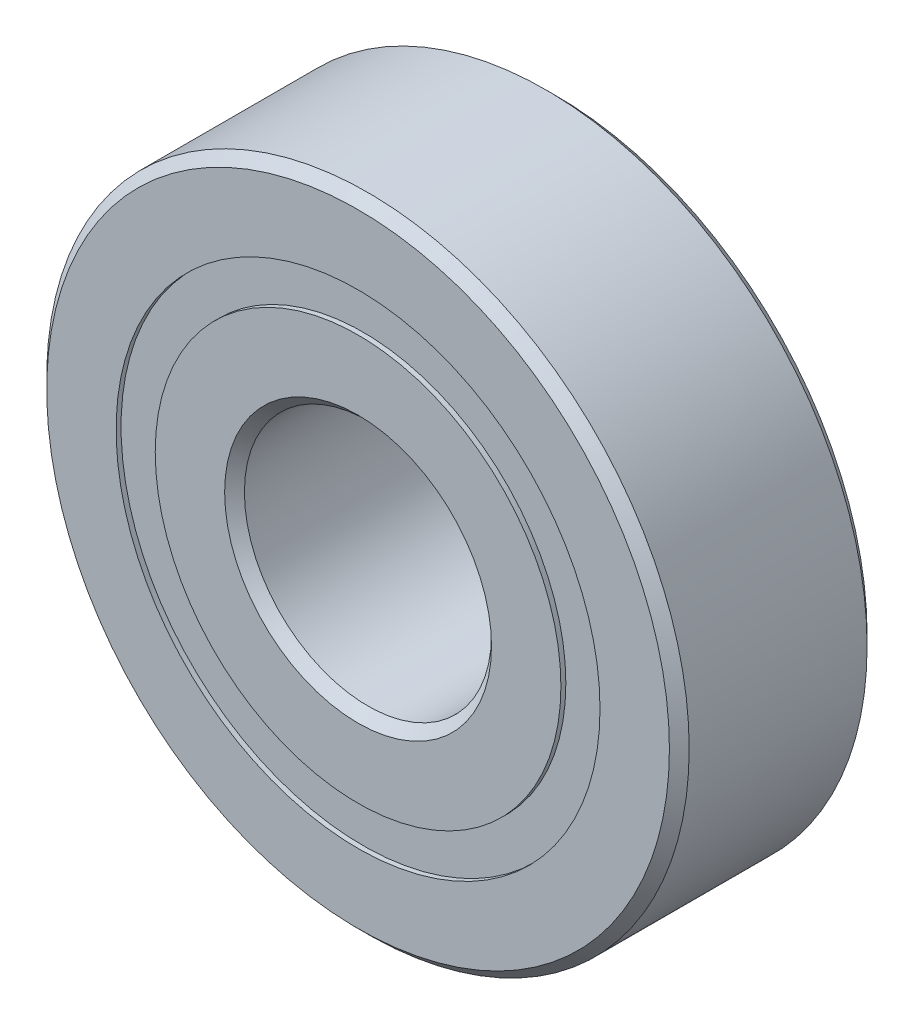
ISO-10303-21;
HEADER;
FILE_DESCRIPTION(('STEP AP214'),'2;1');
FILE_NAME('part.step','',(''),(''),'','','');
FILE_SCHEMA(('AUTOMOTIVE_DESIGN { 1 0 10303 214 1 1 1 1 }'));
ENDSEC;
DATA;
#1=APPLICATION_CONTEXT('core data for automotive mechanical design processes');
#2=APPLICATION_PROTOCOL_DEFINITION('international standard','automotive_design',2000,#1);
#3=PRODUCT_CONTEXT('',#1,'mechanical');
#4=PRODUCT('Part','Part','',(#3));
#5=PRODUCT_RELATED_PRODUCT_CATEGORY('part','',(#4));
#6=PRODUCT_DEFINITION_FORMATION('','',#4);
#7=PRODUCT_DEFINITION_CONTEXT('part definition',#1,'design');
#8=PRODUCT_DEFINITION('design','',#6,#7);
#9=PRODUCT_DEFINITION_SHAPE('','',#8);
#10=(LENGTH_UNIT() NAMED_UNIT(*) SI_UNIT(.MILLI.,.METRE.));
#11=(NAMED_UNIT(*) PLANE_ANGLE_UNIT() SI_UNIT($,.RADIAN.));
#12=(NAMED_UNIT(*) SI_UNIT($,.STERADIAN.) SOLID_ANGLE_UNIT());
#13=UNCERTAINTY_MEASURE_WITH_UNIT(LENGTH_MEASURE(1.E-05),#10,'distance_accuracy_value','');
#14=(GEOMETRIC_REPRESENTATION_CONTEXT(3) GLOBAL_UNCERTAINTY_ASSIGNED_CONTEXT((#13)) GLOBAL_UNIT_ASSIGNED_CONTEXT((#10,
#11,#12)) REPRESENTATION_CONTEXT('',''));
#15=CARTESIAN_POINT('',(0.,0.,0.));
#16=DIRECTION('',(0.,0.,1.));
#17=DIRECTION('',(1.,0.,0.));
#18=AXIS2_PLACEMENT_3D('',#15,#16,#17);
#19=CARTESIAN_POINT('',(0.,4.8956043956044,-1.9));
#20=DIRECTION('',(0.,0.,1.));
#21=DIRECTION('',(1.,0.,0.));
#22=AXIS2_PLACEMENT_3D('',#19,#20,#21);
#23=PLANE('',#22);
#24=CARTESIAN_POINT('',(0.,0.,-1.9));
#25=DIRECTION('',(0.,0.,1.));
#26=DIRECTION('',(1.,0.,0.));
#27=AXIS2_PLACEMENT_3D('',#24,#25,#26);
#28=CIRCLE('',#27,4.8956043956044);
#29=CARTESIAN_POINT('',(4.8956043956044,0.,-1.9));
#30=VERTEX_POINT('',#29);
#31=EDGE_CURVE('E57',#30,#30,#28,.T.);
#32=ORIENTED_EDGE('',*,*,#31,.F.);
#33=EDGE_LOOP('',(#32));
#34=FACE_BOUND('',#33,.T.);
#35=CARTESIAN_POINT('',(0.,0.,-1.9));
#36=DIRECTION('',(0.,0.,1.));
#37=DIRECTION('',(1.,0.,0.));
#38=AXIS2_PLACEMENT_3D('',#35,#36,#37);
#39=CIRCLE('',#38,4.1043956043956);
#40=CARTESIAN_POINT('',(4.1043956043956,0.,-1.9));
#41=VERTEX_POINT('',#40);
#42=EDGE_CURVE('E11',#41,#41,#39,.T.);
#43=ORIENTED_EDGE('',*,*,#42,.T.);
#44=EDGE_LOOP('',(#43));
#45=FACE_BOUND('',#44,.T.);
#46=ADVANCED_FACE('F43',(#34,#45),#23,.F.);
#47=CARTESIAN_POINT('',(0.,0.,2.));
#48=DIRECTION('',(0.,0.,1.));
#49=DIRECTION('',(1.,0.,0.));
#50=AXIS2_PLACEMENT_3D('',#47,#48,#49);
#51=CYLINDRICAL_SURFACE('',#50,4.1043956043956);
#52=ORIENTED_EDGE('',*,*,#42,.F.);
#53=EDGE_LOOP('',(#52));
#54=FACE_BOUND('',#53,.T.);
#55=CARTESIAN_POINT('',(0.,0.,-0.972947220876674));
#56=DIRECTION('',(0.,0.,1.));
#57=DIRECTION('',(1.,0.,0.));
#58=AXIS2_PLACEMENT_3D('',#55,#56,#57);
#59=CIRCLE('',#58,4.1043956043956);
#60=CARTESIAN_POINT('',(4.1043956043956,0.,-0.972947220876674));
#61=VERTEX_POINT('',#60);
#62=EDGE_CURVE('E49',#61,#61,#59,.T.);
#63=ORIENTED_EDGE('',*,*,#62,.T.);
#64=EDGE_LOOP('',(#63));
#65=FACE_BOUND('',#64,.T.);
#66=ADVANCED_FACE('F66',(#54,#65),#51,.F.);
#67=CARTESIAN_POINT('',(0.,4.8956043956044,-0.972947220876674));
#68=DIRECTION('',(0.,0.,-1.));
#69=DIRECTION('',(-1.,0.,0.));
#70=AXIS2_PLACEMENT_3D('',#67,#68,#69);
#71=PLANE('',#70);
#72=ORIENTED_EDGE('',*,*,#62,.F.);
#73=EDGE_LOOP('',(#72));
#74=FACE_BOUND('',#73,.T.);
#75=CARTESIAN_POINT('',(0.,0.,-0.972947220876674));
#76=DIRECTION('',(0.,0.,1.));
#77=DIRECTION('',(1.,0.,0.));
#78=AXIS2_PLACEMENT_3D('',#75,#76,#77);
#79=CIRCLE('',#78,4.8956043956044);
#80=CARTESIAN_POINT('',(4.8956043956044,0.,-0.972947220876674));
#81=VERTEX_POINT('',#80);
#82=EDGE_CURVE('E53',#81,#81,#79,.T.);
#83=ORIENTED_EDGE('',*,*,#82,.T.);
#84=EDGE_LOOP('',(#83));
#85=FACE_BOUND('',#84,.T.);
#86=ADVANCED_FACE('F70',(#74,#85),#71,.F.);
#87=CARTESIAN_POINT('',(0.,0.,2.));
#88=DIRECTION('',(0.,0.,1.));
#89=DIRECTION('',(1.,0.,0.));
#90=AXIS2_PLACEMENT_3D('',#87,#88,#89);
#91=CYLINDRICAL_SURFACE('',#90,4.8956043956044);
#92=ORIENTED_EDGE('',*,*,#82,.F.);
#93=EDGE_LOOP('',(#92));
#94=FACE_BOUND('',#93,.T.);
#95=ORIENTED_EDGE('',*,*,#31,.T.);
#96=EDGE_LOOP('',(#95));
#97=FACE_BOUND('',#96,.T.);
#98=ADVANCED_FACE('F63',(#94,#97),#91,.T.);
#99=CLOSED_SHELL('',(#46,#66,#86,#98));
#100=MANIFOLD_SOLID_BREP('B2',#99);
#101=CARTESIAN_POINT('',(0.,4.8956043956044,1.9));
#102=DIRECTION('',(0.,0.,-1.));
#103=DIRECTION('',(-1.,0.,0.));
#104=AXIS2_PLACEMENT_3D('',#101,#102,#103);
#105=PLANE('',#104);
#106=CARTESIAN_POINT('',(0.,0.,1.9));
#107=DIRECTION('',(0.,0.,1.));
#108=DIRECTION('',(1.,0.,0.));
#109=AXIS2_PLACEMENT_3D('',#106,#107,#108);
#110=CIRCLE('',#109,4.1043956043956);
#111=CARTESIAN_POINT('',(4.1043956043956,0.,1.9));
#112=VERTEX_POINT('',#111);
#113=EDGE_CURVE('E42',#112,#112,#110,.T.);
#114=ORIENTED_EDGE('',*,*,#113,.F.);
#115=EDGE_LOOP('',(#114));
#116=FACE_BOUND('',#115,.T.);
#117=CARTESIAN_POINT('',(0.,0.,1.9));
#118=DIRECTION('',(0.,0.,1.));
#119=DIRECTION('',(1.,0.,0.));
#120=AXIS2_PLACEMENT_3D('',#117,#118,#119);
#121=CIRCLE('',#120,4.8956043956044);
#122=CARTESIAN_POINT('',(4.8956043956044,0.,1.9));
#123=VERTEX_POINT('',#122);
#124=EDGE_CURVE('E124',#123,#123,#121,.T.);
#125=ORIENTED_EDGE('',*,*,#124,.T.);
#126=EDGE_LOOP('',(#125));
#127=FACE_BOUND('',#126,.T.);
#128=ADVANCED_FACE('F110',(#116,#127),#105,.F.);
#129=CARTESIAN_POINT('',(0.,0.,2.));
#130=DIRECTION('',(0.,0.,1.));
#131=DIRECTION('',(1.,0.,0.));
#132=AXIS2_PLACEMENT_3D('',#129,#130,#131);
#133=CYLINDRICAL_SURFACE('',#132,4.1043956043956);
#134=CARTESIAN_POINT('',(0.,0.,0.972947220876673));
#135=DIRECTION('',(0.,0.,1.));
#136=DIRECTION('',(1.,0.,0.));
#137=AXIS2_PLACEMENT_3D('',#134,#135,#136);
#138=CIRCLE('',#137,4.1043956043956);
#139=CARTESIAN_POINT('',(4.1043956043956,0.,0.972947220876673));
#140=VERTEX_POINT('',#139);
#141=EDGE_CURVE('E116',#140,#140,#138,.T.);
#142=ORIENTED_EDGE('',*,*,#141,.F.);
#143=EDGE_LOOP('',(#142));
#144=FACE_BOUND('',#143,.T.);
#145=ORIENTED_EDGE('',*,*,#113,.T.);
#146=EDGE_LOOP('',(#145));
#147=FACE_BOUND('',#146,.T.);
#148=ADVANCED_FACE('F139',(#144,#147),#133,.F.);
#149=CARTESIAN_POINT('',(0.,4.8956043956044,0.972947220876673));
#150=DIRECTION('',(0.,0.,1.));
#151=DIRECTION('',(1.,0.,0.));
#152=AXIS2_PLACEMENT_3D('',#149,#150,#151);
#153=PLANE('',#152);
#154=CARTESIAN_POINT('',(0.,0.,0.972947220876673));
#155=DIRECTION('',(0.,0.,1.));
#156=DIRECTION('',(1.,0.,0.));
#157=AXIS2_PLACEMENT_3D('',#154,#155,#156);
#158=CIRCLE('',#157,4.8956043956044);
#159=CARTESIAN_POINT('',(4.8956043956044,0.,0.972947220876673));
#160=VERTEX_POINT('',#159);
#161=EDGE_CURVE('E120',#160,#160,#158,.T.);
#162=ORIENTED_EDGE('',*,*,#161,.F.);
#163=EDGE_LOOP('',(#162));
#164=FACE_BOUND('',#163,.T.);
#165=ORIENTED_EDGE('',*,*,#141,.T.);
#166=EDGE_LOOP('',(#165));
#167=FACE_BOUND('',#166,.T.);
#168=ADVANCED_FACE('F134',(#164,#167),#153,.F.);
#169=CARTESIAN_POINT('',(0.,0.,2.));
#170=DIRECTION('',(0.,0.,1.));
#171=DIRECTION('',(1.,0.,0.));
#172=AXIS2_PLACEMENT_3D('',#169,#170,#171);
#173=CYLINDRICAL_SURFACE('',#172,4.8956043956044);
#174=ORIENTED_EDGE('',*,*,#124,.F.);
#175=EDGE_LOOP('',(#174));
#176=FACE_BOUND('',#175,.T.);
#177=ORIENTED_EDGE('',*,*,#161,.T.);
#178=EDGE_LOOP('',(#177));
#179=FACE_BOUND('',#178,.T.);
#180=ADVANCED_FACE('F131',(#176,#179),#173,.T.);
#181=CLOSED_SHELL('',(#128,#148,#168,#180));
#182=MANIFOLD_SOLID_BREP('B6',#181);
#183=CARTESIAN_POINT('',(-2.24999999999995,3.89711431703,0.));
#184=DIRECTION('',(0.,0.,1.));
#185=DIRECTION('',(-0.499999999999989,0.866025403784445,0.));
#186=AXIS2_PLACEMENT_3D('',#183,#184,#185);
#187=SPHERICAL_SURFACE('',#186,0.972947220876674);
#188=CARTESIAN_POINT('',(-2.24999999999995,3.89711431703,0.972947220876673));
#189=VERTEX_POINT('',#188);
#190=VERTEX_LOOP('',#189);
#191=FACE_BOUND('',#190,.T.);
#192=ADVANCED_FACE('F177',(#191),#187,.T.);
#193=CLOSED_SHELL('',(#192));
#194=MANIFOLD_SOLID_BREP('B37',#193);
#195=CARTESIAN_POINT('',(-3.89711431702995,2.25000000000005,0.));
#196=DIRECTION('',(0.,0.,1.));
#197=DIRECTION('',(-0.866025403784433,0.50000000000001,0.));
#198=AXIS2_PLACEMENT_3D('',#195,#196,#197);
#199=SPHERICAL_SURFACE('',#198,0.972947220876674);
#200=CARTESIAN_POINT('',(-3.89711431702995,2.25000000000005,0.972947220876673));
#201=VERTEX_POINT('',#200);
#202=VERTEX_LOOP('',#201);
#203=FACE_BOUND('',#202,.T.);
#204=ADVANCED_FACE('F197',(#203),#199,.T.);
#205=CLOSED_SHELL('',(#204));
#206=MANIFOLD_SOLID_BREP('B106',#205);
#207=CARTESIAN_POINT('',(-4.5,0.,0.));
#208=DIRECTION('',(0.,0.,1.));
#209=DIRECTION('',(-1.,0.,0.));
#210=AXIS2_PLACEMENT_3D('',#207,#208,#209);
#211=SPHERICAL_SURFACE('',#210,0.972947220876674);
#212=CARTESIAN_POINT('',(-4.5,0.,0.972947220876673));
#213=VERTEX_POINT('',#212);
#214=VERTEX_LOOP('',#213);
#215=FACE_BOUND('',#214,.T.);
#216=ADVANCED_FACE('F217',(#215),#211,.T.);
#217=CLOSED_SHELL('',(#216));
#218=MANIFOLD_SOLID_BREP('B173',#217);
#219=CARTESIAN_POINT('',(-3.89711431702999,-2.24999999999996,0.));
#220=DIRECTION('',(0.,0.,1.));
#221=DIRECTION('',(-0.866025403784443,-0.499999999999992,0.));
#222=AXIS2_PLACEMENT_3D('',#219,#220,#221);
#223=SPHERICAL_SURFACE('',#222,0.972947220876674);
#224=CARTESIAN_POINT('',(-3.89711431702999,-2.24999999999996,0.972947220876673));
#225=VERTEX_POINT('',#224);
#226=VERTEX_LOOP('',#225);
#227=FACE_BOUND('',#226,.T.);
#228=ADVANCED_FACE('F237',(#227),#223,.T.);
#229=CLOSED_SHELL('',(#228));
#230=MANIFOLD_SOLID_BREP('B193',#229);
#231=CARTESIAN_POINT('',(-2.25000000000003,-3.89711431702996,0.));
#232=DIRECTION('',(0.,0.,1.));
#233=DIRECTION('',(-0.500000000000007,-0.866025403784435,0.));
#234=AXIS2_PLACEMENT_3D('',#231,#232,#233);
#235=SPHERICAL_SURFACE('',#234,0.972947220876674);
#236=CARTESIAN_POINT('',(-2.25000000000003,-3.89711431702996,0.972947220876673));
#237=VERTEX_POINT('',#236);
#238=VERTEX_LOOP('',#237);
#239=FACE_BOUND('',#238,.T.);
#240=ADVANCED_FACE('F257',(#239),#235,.T.);
#241=CLOSED_SHELL('',(#240));
#242=MANIFOLD_SOLID_BREP('B213',#241);
#243=CARTESIAN_POINT('',(0.,-4.5,0.));
#244=DIRECTION('',(0.,0.,1.));
#245=DIRECTION('',(0.,-1.,0.));
#246=AXIS2_PLACEMENT_3D('',#243,#244,#245);
#247=SPHERICAL_SURFACE('',#246,0.972947220876674);
#248=CARTESIAN_POINT('',(0.,-4.5,0.972947220876673));
#249=VERTEX_POINT('',#248);
#250=VERTEX_LOOP('',#249);
#251=FACE_BOUND('',#250,.T.);
#252=ADVANCED_FACE('F277',(#251),#247,.T.);
#253=CLOSED_SHELL('',(#252));
#254=MANIFOLD_SOLID_BREP('B233',#253);
#255=CARTESIAN_POINT('',(2.24999999999998,-3.89711431702999,0.));
#256=DIRECTION('',(0.,0.,1.));
#257=DIRECTION('',(0.499999999999995,-0.866025403784442,0.));
#258=AXIS2_PLACEMENT_3D('',#255,#256,#257);
#259=SPHERICAL_SURFACE('',#258,0.972947220876674);
#260=CARTESIAN_POINT('',(2.24999999999998,-3.89711431702999,0.972947220876673));
#261=VERTEX_POINT('',#260);
#262=VERTEX_LOOP('',#261);
#263=FACE_BOUND('',#262,.T.);
#264=ADVANCED_FACE('F297',(#263),#259,.T.);
#265=CLOSED_SHELL('',(#264));
#266=MANIFOLD_SOLID_BREP('B253',#265);
#267=CARTESIAN_POINT('',(3.89711431702996,-2.25000000000002,0.));
#268=DIRECTION('',(0.,0.,1.));
#269=DIRECTION('',(0.866025403784436,-0.500000000000004,0.));
#270=AXIS2_PLACEMENT_3D('',#267,#268,#269);
#271=SPHERICAL_SURFACE('',#270,0.972947220876674);
#272=CARTESIAN_POINT('',(3.89711431702996,-2.25000000000002,0.972947220876673));
#273=VERTEX_POINT('',#272);
#274=VERTEX_LOOP('',#273);
#275=FACE_BOUND('',#274,.T.);
#276=ADVANCED_FACE('F317',(#275),#271,.T.);
#277=CLOSED_SHELL('',(#276));
#278=MANIFOLD_SOLID_BREP('B273',#277);
#279=CARTESIAN_POINT('',(4.5,0.,0.));
#280=DIRECTION('',(0.,0.,1.));
#281=DIRECTION('',(1.,0.,0.));
#282=AXIS2_PLACEMENT_3D('',#279,#280,#281);
#283=SPHERICAL_SURFACE('',#282,0.972947220876674);
#284=CARTESIAN_POINT('',(4.5,0.,0.972947220876673));
#285=VERTEX_POINT('',#284);
#286=VERTEX_LOOP('',#285);
#287=FACE_BOUND('',#286,.T.);
#288=ADVANCED_FACE('F337',(#287),#283,.T.);
#289=CLOSED_SHELL('',(#288));
#290=MANIFOLD_SOLID_BREP('B293',#289);
#291=CARTESIAN_POINT('',(3.89711431702998,2.24999999999999,0.));
#292=DIRECTION('',(0.,0.,1.));
#293=DIRECTION('',(0.86602540378444,0.499999999999998,0.));
#294=AXIS2_PLACEMENT_3D('',#291,#292,#293);
#295=SPHERICAL_SURFACE('',#294,0.972947220876674);
#296=CARTESIAN_POINT('',(3.89711431702998,2.24999999999999,0.972947220876673));
#297=VERTEX_POINT('',#296);
#298=VERTEX_LOOP('',#297);
#299=FACE_BOUND('',#298,.T.);
#300=ADVANCED_FACE('F357',(#299),#295,.T.);
#301=CLOSED_SHELL('',(#300));
#302=MANIFOLD_SOLID_BREP('B313',#301);
#303=CARTESIAN_POINT('',(2.25,3.89711431702997,0.));
#304=DIRECTION('',(0.,0.,1.));
#305=DIRECTION('',(0.500000000000001,0.866025403784438,0.));
#306=AXIS2_PLACEMENT_3D('',#303,#304,#305);
#307=SPHERICAL_SURFACE('',#306,0.972947220876674);
#308=CARTESIAN_POINT('',(2.25,3.89711431702997,0.972947220876673));
#309=VERTEX_POINT('',#308);
#310=VERTEX_LOOP('',#309);
#311=FACE_BOUND('',#310,.T.);
#312=ADVANCED_FACE('F377',(#311),#307,.T.);
#313=CLOSED_SHELL('',(#312));
#314=MANIFOLD_SOLID_BREP('B333',#313);
#315=CARTESIAN_POINT('',(0.,4.5,0.));
#316=DIRECTION('',(0.,0.,1.));
#317=DIRECTION('',(0.,1.,0.));
#318=AXIS2_PLACEMENT_3D('',#315,#316,#317);
#319=SPHERICAL_SURFACE('',#318,0.972947220876674);
#320=CARTESIAN_POINT('',(0.,4.5,0.972947220876673));
#321=VERTEX_POINT('',#320);
#322=VERTEX_LOOP('',#321);
#323=FACE_BOUND('',#322,.T.);
#324=ADVANCED_FACE('F399',(#323),#319,.T.);
#325=CLOSED_SHELL('',(#324));
#326=MANIFOLD_SOLID_BREP('B353',#325);
#327=CARTESIAN_POINT('',(0.,4.1043956043956,2.));
#328=DIRECTION('',(0.,0.,-1.));
#329=DIRECTION('',(-1.,0.,0.));
#330=AXIS2_PLACEMENT_3D('',#327,#328,#329);
#331=PLANE('',#330);
#332=CARTESIAN_POINT('',(0.,0.,2.));
#333=DIRECTION('',(0.,0.,1.));
#334=DIRECTION('',(1.,0.,0.));
#335=AXIS2_PLACEMENT_3D('',#332,#333,#334);
#336=CIRCLE('',#335,2.7);
#337=CARTESIAN_POINT('',(2.7,0.,2.));
#338=VERTEX_POINT('',#337);
#339=EDGE_CURVE('E446',#338,#338,#336,.T.);
#340=ORIENTED_EDGE('',*,*,#339,.F.);
#341=EDGE_LOOP('',(#340));
#342=FACE_BOUND('',#341,.T.);
#343=CARTESIAN_POINT('',(0.,0.,2.));
#344=DIRECTION('',(0.,0.,1.));
#345=DIRECTION('',(1.,0.,0.));
#346=AXIS2_PLACEMENT_3D('',#343,#344,#345);
#347=CIRCLE('',#346,4.1043956043956);
#348=CARTESIAN_POINT('',(4.1043956043956,0.,2.));
#349=VERTEX_POINT('',#348);
#350=EDGE_CURVE('E398',#349,#349,#347,.T.);
#351=ORIENTED_EDGE('',*,*,#350,.T.);
#352=EDGE_LOOP('',(#351));
#353=FACE_BOUND('',#352,.T.);
#354=ADVANCED_FACE('F418',(#342,#353),#331,.F.);
#355=CARTESIAN_POINT('',(0.,0.,2.));
#356=DIRECTION('',(0.,0.,1.));
#357=DIRECTION('',(1.,0.,0.));
#358=AXIS2_PLACEMENT_3D('',#355,#356,#357);
#359=CYLINDRICAL_SURFACE('',#358,4.1043956043956);
#360=ORIENTED_EDGE('',*,*,#350,.F.);
#361=EDGE_LOOP('',(#360));
#362=FACE_BOUND('',#361,.T.);
#363=CARTESIAN_POINT('',(0.,0.,0.888888888888889));
#364=DIRECTION('',(0.,0.,1.));
#365=DIRECTION('',(1.,0.,0.));
#366=AXIS2_PLACEMENT_3D('',#363,#364,#365);
#367=CIRCLE('',#366,4.1043956043956);
#368=CARTESIAN_POINT('',(4.1043956043956,0.,0.888888888888889));
#369=VERTEX_POINT('',#368);
#370=EDGE_CURVE('E424',#369,#369,#367,.T.);
#371=ORIENTED_EDGE('',*,*,#370,.T.);
#372=EDGE_LOOP('',(#371));
#373=FACE_BOUND('',#372,.T.);
#374=ADVANCED_FACE('F453',(#362,#373),#359,.T.);
#375=CARTESIAN_POINT('',(0.,0.,0.));
#376=DIRECTION('',(0.,0.,1.));
#377=DIRECTION('',(1.,0.,0.));
#378=AXIS2_PLACEMENT_3D('',#375,#376,#377);
#379=TOROIDAL_SURFACE('',#378,4.5,0.972947220876673);
#380=ORIENTED_EDGE('',*,*,#370,.F.);
#381=EDGE_LOOP('',(#380));
#382=FACE_BOUND('',#381,.T.);
#383=CARTESIAN_POINT('',(0.,0.,-0.88888888888889));
#384=DIRECTION('',(0.,0.,1.));
#385=DIRECTION('',(1.,0.,0.));
#386=AXIS2_PLACEMENT_3D('',#383,#384,#385);
#387=CIRCLE('',#386,4.1043956043956);
#388=CARTESIAN_POINT('',(4.1043956043956,0.,-0.88888888888889));
#389=VERTEX_POINT('',#388);
#390=EDGE_CURVE('E428',#389,#389,#387,.T.);
#391=ORIENTED_EDGE('',*,*,#390,.T.);
#392=EDGE_LOOP('',(#391));
#393=FACE_BOUND('',#392,.T.);
#394=ADVANCED_FACE('F457',(#382,#393),#379,.F.);
#395=CARTESIAN_POINT('',(0.,0.,2.));
#396=DIRECTION('',(0.,0.,1.));
#397=DIRECTION('',(1.,0.,0.));
#398=AXIS2_PLACEMENT_3D('',#395,#396,#397);
#399=CYLINDRICAL_SURFACE('',#398,4.1043956043956);
#400=ORIENTED_EDGE('',*,*,#390,.F.);
#401=EDGE_LOOP('',(#400));
#402=FACE_BOUND('',#401,.T.);
#403=CARTESIAN_POINT('',(0.,0.,-2.));
#404=DIRECTION('',(0.,0.,1.));
#405=DIRECTION('',(1.,0.,0.));
#406=AXIS2_PLACEMENT_3D('',#403,#404,#405);
#407=CIRCLE('',#406,4.1043956043956);
#408=CARTESIAN_POINT('',(4.1043956043956,0.,-2.));
#409=VERTEX_POINT('',#408);
#410=EDGE_CURVE('E432',#409,#409,#407,.T.);
#411=ORIENTED_EDGE('',*,*,#410,.T.);
#412=EDGE_LOOP('',(#411));
#413=FACE_BOUND('',#412,.T.);
#414=ADVANCED_FACE('F462',(#402,#413),#399,.T.);
#415=CARTESIAN_POINT('',(0.,2.7,-2.));
#416=DIRECTION('',(0.,0.,1.));
#417=DIRECTION('',(1.,0.,0.));
#418=AXIS2_PLACEMENT_3D('',#415,#416,#417);
#419=PLANE('',#418);
#420=ORIENTED_EDGE('',*,*,#410,.F.);
#421=EDGE_LOOP('',(#420));
#422=FACE_BOUND('',#421,.T.);
#423=CARTESIAN_POINT('',(0.,0.,-2.));
#424=DIRECTION('',(0.,0.,1.));
#425=DIRECTION('',(1.,0.,0.));
#426=AXIS2_PLACEMENT_3D('',#423,#424,#425);
#427=CIRCLE('',#426,2.7);
#428=CARTESIAN_POINT('',(2.7,0.,-2.));
#429=VERTEX_POINT('',#428);
#430=EDGE_CURVE('E437',#429,#429,#427,.T.);
#431=ORIENTED_EDGE('',*,*,#430,.T.);
#432=EDGE_LOOP('',(#431));
#433=FACE_BOUND('',#432,.T.);
#434=ADVANCED_FACE('F468',(#422,#433),#419,.F.);
#435=CARTESIAN_POINT('',(0.,0.,-1.8));
#436=DIRECTION('',(0.,0.,-1.));
#437=DIRECTION('',(-1.,0.,0.));
#438=AXIS2_PLACEMENT_3D('',#435,#436,#437);
#439=CONICAL_SURFACE('',#438,2.5,0.785398163397454);
#440=ORIENTED_EDGE('',*,*,#430,.F.);
#441=EDGE_LOOP('',(#440));
#442=FACE_BOUND('',#441,.T.);
#443=CARTESIAN_POINT('',(0.,0.,-1.8));
#444=DIRECTION('',(0.,0.,1.));
#445=DIRECTION('',(1.,0.,0.));
#446=AXIS2_PLACEMENT_3D('',#443,#444,#445);
#447=CIRCLE('',#446,2.5);
#448=CARTESIAN_POINT('',(2.5,0.,-1.8));
#449=VERTEX_POINT('',#448);
#450=EDGE_CURVE('E440',#449,#449,#447,.T.);
#451=ORIENTED_EDGE('',*,*,#450,.T.);
#452=EDGE_LOOP('',(#451));
#453=FACE_BOUND('',#452,.T.);
#454=ADVANCED_FACE('F472',(#442,#453),#439,.F.);
#455=CARTESIAN_POINT('',(0.,0.,2.));
#456=DIRECTION('',(0.,0.,1.));
#457=DIRECTION('',(1.,0.,0.));
#458=AXIS2_PLACEMENT_3D('',#455,#456,#457);
#459=CYLINDRICAL_SURFACE('',#458,2.5);
#460=ORIENTED_EDGE('',*,*,#450,.F.);
#461=EDGE_LOOP('',(#460));
#462=FACE_BOUND('',#461,.T.);
#463=CARTESIAN_POINT('',(0.,0.,1.8));
#464=DIRECTION('',(0.,0.,1.));
#465=DIRECTION('',(1.,0.,0.));
#466=AXIS2_PLACEMENT_3D('',#463,#464,#465);
#467=CIRCLE('',#466,2.5);
#468=CARTESIAN_POINT('',(2.5,0.,1.8));
#469=VERTEX_POINT('',#468);
#470=EDGE_CURVE('E443',#469,#469,#467,.T.);
#471=ORIENTED_EDGE('',*,*,#470,.T.);
#472=EDGE_LOOP('',(#471));
#473=FACE_BOUND('',#472,.T.);
#474=ADVANCED_FACE('F476',(#462,#473),#459,.F.);
#475=CARTESIAN_POINT('',(0.,0.,2.));
#476=DIRECTION('',(0.,0.,1.));
#477=DIRECTION('',(1.,0.,0.));
#478=AXIS2_PLACEMENT_3D('',#475,#476,#477);
#479=CONICAL_SURFACE('',#478,2.7,0.785398163397442);
#480=ORIENTED_EDGE('',*,*,#470,.F.);
#481=EDGE_LOOP('',(#480));
#482=FACE_BOUND('',#481,.T.);
#483=ORIENTED_EDGE('',*,*,#339,.T.);
#484=EDGE_LOOP('',(#483));
#485=FACE_BOUND('',#484,.T.);
#486=ADVANCED_FACE('F450',(#482,#485),#479,.F.);
#487=CLOSED_SHELL('',(#354,#374,#394,#414,#434,#454,#474,#486));
#488=MANIFOLD_SOLID_BREP('B373',#487);
#489=CARTESIAN_POINT('',(0.,0.,1.8));
#490=DIRECTION('',(0.,0.,-1.));
#491=DIRECTION('',(-1.,0.,0.));
#492=AXIS2_PLACEMENT_3D('',#489,#490,#491);
#493=CONICAL_SURFACE('',#492,6.5,0.78539816339745);
#494=CARTESIAN_POINT('',(0.,0.,2.));
#495=DIRECTION('',(0.,0.,1.));
#496=DIRECTION('',(1.,0.,0.));
#497=AXIS2_PLACEMENT_3D('',#494,#495,#496);
#498=CIRCLE('',#497,6.3);
#499=CARTESIAN_POINT('',(6.3,0.,2.));
#500=VERTEX_POINT('',#499);
#501=EDGE_CURVE('E567',#500,#500,#498,.T.);
#502=ORIENTED_EDGE('',*,*,#501,.F.);
#503=EDGE_LOOP('',(#502));
#504=FACE_BOUND('',#503,.T.);
#505=CARTESIAN_POINT('',(0.,0.,1.8));
#506=DIRECTION('',(0.,0.,1.));
#507=DIRECTION('',(1.,0.,0.));
#508=AXIS2_PLACEMENT_3D('',#505,#506,#507);
#509=CIRCLE('',#508,6.5);
#510=CARTESIAN_POINT('',(6.5,0.,1.8));
#511=VERTEX_POINT('',#510);
#512=EDGE_CURVE('E417',#511,#511,#509,.T.);
#513=ORIENTED_EDGE('',*,*,#512,.T.);
#514=EDGE_LOOP('',(#513));
#515=FACE_BOUND('',#514,.T.);
#516=ADVANCED_FACE('F539',(#504,#515),#493,.T.);
#517=CARTESIAN_POINT('',(0.,0.,2.));
#518=DIRECTION('',(0.,0.,1.));
#519=DIRECTION('',(1.,0.,0.));
#520=AXIS2_PLACEMENT_3D('',#517,#518,#519);
#521=CYLINDRICAL_SURFACE('',#520,6.5);
#522=ORIENTED_EDGE('',*,*,#512,.F.);
#523=EDGE_LOOP('',(#522));
#524=FACE_BOUND('',#523,.T.);
#525=CARTESIAN_POINT('',(0.,0.,-1.8));
#526=DIRECTION('',(0.,0.,1.));
#527=DIRECTION('',(1.,0.,0.));
#528=AXIS2_PLACEMENT_3D('',#525,#526,#527);
#529=CIRCLE('',#528,6.5);
#530=CARTESIAN_POINT('',(6.5,0.,-1.8));
#531=VERTEX_POINT('',#530);
#532=EDGE_CURVE('E545',#531,#531,#529,.T.);
#533=ORIENTED_EDGE('',*,*,#532,.T.);
#534=EDGE_LOOP('',(#533));
#535=FACE_BOUND('',#534,.T.);
#536=ADVANCED_FACE('F574',(#524,#535),#521,.T.);
#537=CARTESIAN_POINT('',(0.,0.,-2.));
#538=DIRECTION('',(0.,0.,1.));
#539=DIRECTION('',(1.,0.,0.));
#540=AXIS2_PLACEMENT_3D('',#537,#538,#539);
#541=CONICAL_SURFACE('',#540,6.3,0.78539816339745);
#542=ORIENTED_EDGE('',*,*,#532,.F.);
#543=EDGE_LOOP('',(#542));
#544=FACE_BOUND('',#543,.T.);
#545=CARTESIAN_POINT('',(0.,0.,-2.));
#546=DIRECTION('',(0.,0.,1.));
#547=DIRECTION('',(1.,0.,0.));
#548=AXIS2_PLACEMENT_3D('',#545,#546,#547);
#549=CIRCLE('',#548,6.3);
#550=CARTESIAN_POINT('',(6.3,0.,-2.));
#551=VERTEX_POINT('',#550);
#552=EDGE_CURVE('E549',#551,#551,#549,.T.);
#553=ORIENTED_EDGE('',*,*,#552,.T.);
#554=EDGE_LOOP('',(#553));
#555=FACE_BOUND('',#554,.T.);
#556=ADVANCED_FACE('F578',(#544,#555),#541,.T.);
#557=CARTESIAN_POINT('',(0.,6.3,-2.));
#558=DIRECTION('',(0.,0.,1.));
#559=DIRECTION('',(1.,0.,0.));
#560=AXIS2_PLACEMENT_3D('',#557,#558,#559);
#561=PLANE('',#560);
#562=ORIENTED_EDGE('',*,*,#552,.F.);
#563=EDGE_LOOP('',(#562));
#564=FACE_BOUND('',#563,.T.);
#565=CARTESIAN_POINT('',(0.,0.,-2.));
#566=DIRECTION('',(0.,0.,1.));
#567=DIRECTION('',(1.,0.,0.));
#568=AXIS2_PLACEMENT_3D('',#565,#566,#567);
#569=CIRCLE('',#568,4.8956043956044);
#570=CARTESIAN_POINT('',(4.8956043956044,0.,-2.));
#571=VERTEX_POINT('',#570);
#572=EDGE_CURVE('E553',#571,#571,#569,.T.);
#573=ORIENTED_EDGE('',*,*,#572,.T.);
#574=EDGE_LOOP('',(#573));
#575=FACE_BOUND('',#574,.T.);
#576=ADVANCED_FACE('F583',(#564,#575),#561,.F.);
#577=CARTESIAN_POINT('',(0.,0.,2.));
#578=DIRECTION('',(0.,0.,1.));
#579=DIRECTION('',(1.,0.,0.));
#580=AXIS2_PLACEMENT_3D('',#577,#578,#579);
#581=CYLINDRICAL_SURFACE('',#580,4.8956043956044);
#582=ORIENTED_EDGE('',*,*,#572,.F.);
#583=EDGE_LOOP('',(#582));
#584=FACE_BOUND('',#583,.T.);
#585=CARTESIAN_POINT('',(0.,0.,-0.888888888888889));
#586=DIRECTION('',(0.,0.,1.));
#587=DIRECTION('',(1.,0.,0.));
#588=AXIS2_PLACEMENT_3D('',#585,#586,#587);
#589=CIRCLE('',#588,4.8956043956044);
#590=CARTESIAN_POINT('',(4.8956043956044,0.,-0.888888888888889));
#591=VERTEX_POINT('',#590);
#592=EDGE_CURVE('E558',#591,#591,#589,.T.);
#593=ORIENTED_EDGE('',*,*,#592,.T.);
#594=EDGE_LOOP('',(#593));
#595=FACE_BOUND('',#594,.T.);
#596=ADVANCED_FACE('F589',(#584,#595),#581,.F.);
#597=CARTESIAN_POINT('',(0.,0.,0.));
#598=DIRECTION('',(0.,0.,1.));
#599=DIRECTION('',(1.,0.,0.));
#600=AXIS2_PLACEMENT_3D('',#597,#598,#599);
#601=TOROIDAL_SURFACE('',#600,4.5,0.972947220876673);
#602=ORIENTED_EDGE('',*,*,#592,.F.);
#603=EDGE_LOOP('',(#602));
#604=FACE_BOUND('',#603,.T.);
#605=CARTESIAN_POINT('',(0.,0.,0.888888888888889));
#606=DIRECTION('',(0.,0.,1.));
#607=DIRECTION('',(1.,0.,0.));
#608=AXIS2_PLACEMENT_3D('',#605,#606,#607);
#609=CIRCLE('',#608,4.8956043956044);
#610=CARTESIAN_POINT('',(4.8956043956044,0.,0.888888888888889));
#611=VERTEX_POINT('',#610);
#612=EDGE_CURVE('E561',#611,#611,#609,.T.);
#613=ORIENTED_EDGE('',*,*,#612,.T.);
#614=EDGE_LOOP('',(#613));
#615=FACE_BOUND('',#614,.T.);
#616=ADVANCED_FACE('F593',(#604,#615),#601,.F.);
#617=CARTESIAN_POINT('',(0.,0.,2.));
#618=DIRECTION('',(0.,0.,1.));
#619=DIRECTION('',(1.,0.,0.));
#620=AXIS2_PLACEMENT_3D('',#617,#618,#619);
#621=CYLINDRICAL_SURFACE('',#620,4.8956043956044);
#622=ORIENTED_EDGE('',*,*,#612,.F.);
#623=EDGE_LOOP('',(#622));
#624=FACE_BOUND('',#623,.T.);
#625=CARTESIAN_POINT('',(0.,0.,2.));
#626=DIRECTION('',(0.,0.,1.));
#627=DIRECTION('',(1.,0.,0.));
#628=AXIS2_PLACEMENT_3D('',#625,#626,#627);
#629=CIRCLE('',#628,4.8956043956044);
#630=CARTESIAN_POINT('',(4.8956043956044,0.,2.));
#631=VERTEX_POINT('',#630);
#632=EDGE_CURVE('E564',#631,#631,#629,.T.);
#633=ORIENTED_EDGE('',*,*,#632,.T.);
#634=EDGE_LOOP('',(#633));
#635=FACE_BOUND('',#634,.T.);
#636=ADVANCED_FACE('F597',(#624,#635),#621,.F.);
#637=CARTESIAN_POINT('',(0.,6.3,2.));
#638=DIRECTION('',(0.,0.,-1.));
#639=DIRECTION('',(-1.,0.,0.));
#640=AXIS2_PLACEMENT_3D('',#637,#638,#639);
#641=PLANE('',#640);
#642=ORIENTED_EDGE('',*,*,#632,.F.);
#643=EDGE_LOOP('',(#642));
#644=FACE_BOUND('',#643,.T.);
#645=ORIENTED_EDGE('',*,*,#501,.T.);
#646=EDGE_LOOP('',(#645));
#647=FACE_BOUND('',#646,.T.);
#648=ADVANCED_FACE('F571',(#644,#647),#641,.F.);
#649=CLOSED_SHELL('',(#516,#536,#556,#576,#596,#616,#636,#648));
#650=MANIFOLD_SOLID_BREP('B393',#649);
#651=ADVANCED_BREP_SHAPE_REPRESENTATION('',(#18,#100,#182,#194,#206,#218,#230,#242,#254,#266,
#278,#290,#302,#314,#326,#488,#650),#14);
#652=SHAPE_DEFINITION_REPRESENTATION(#9,#651);
ENDSEC;
END-ISO-10303-21;
